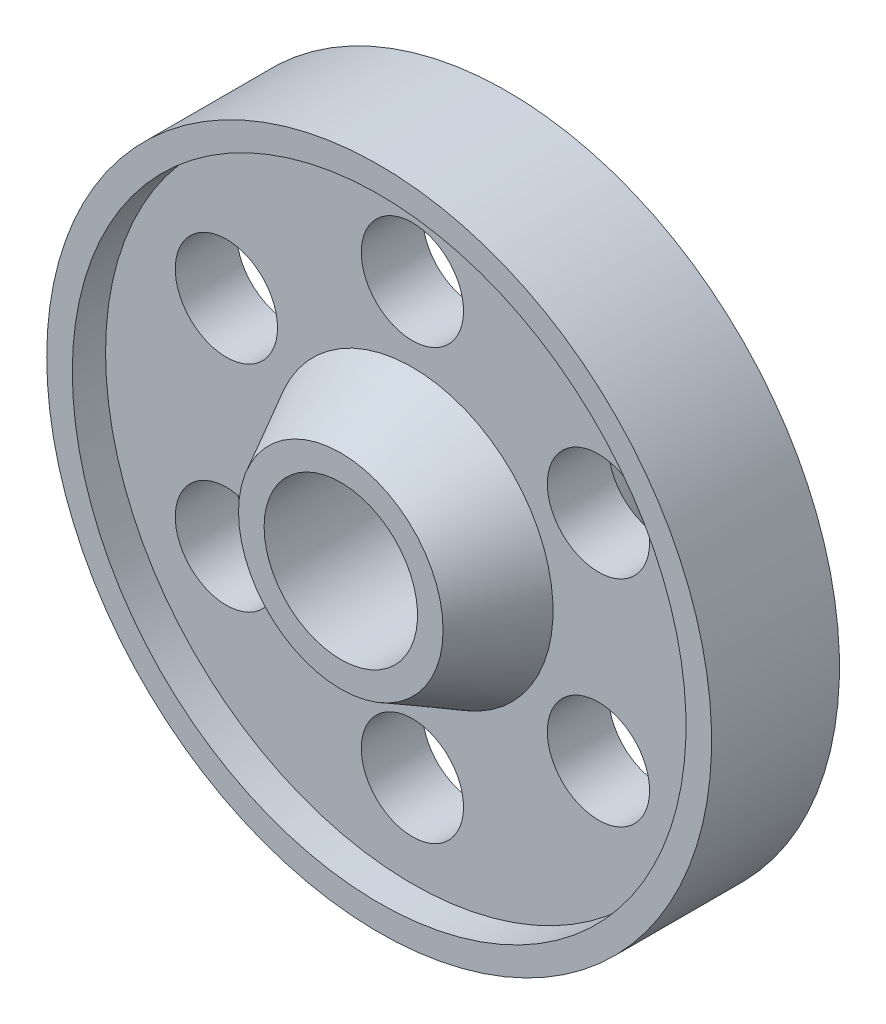
ISO-10303-21;
HEADER;
FILE_DESCRIPTION(('STEP AP214'),'2;1');
FILE_NAME('part.step','',(''),(''),'','','');
FILE_SCHEMA(('AUTOMOTIVE_DESIGN { 1 0 10303 214 1 1 1 1 }'));
ENDSEC;
DATA;
#1=APPLICATION_CONTEXT('core data for automotive mechanical design processes');
#2=APPLICATION_PROTOCOL_DEFINITION('international standard','automotive_design',2000,#1);
#3=PRODUCT_CONTEXT('',#1,'mechanical');
#4=PRODUCT('Part','Part','',(#3));
#5=PRODUCT_RELATED_PRODUCT_CATEGORY('part','',(#4));
#6=PRODUCT_DEFINITION_FORMATION('','',#4);
#7=PRODUCT_DEFINITION_CONTEXT('part definition',#1,'design');
#8=PRODUCT_DEFINITION('design','',#6,#7);
#9=PRODUCT_DEFINITION_SHAPE('','',#8);
#10=(LENGTH_UNIT() NAMED_UNIT(*) SI_UNIT(.MILLI.,.METRE.));
#11=(NAMED_UNIT(*) PLANE_ANGLE_UNIT() SI_UNIT($,.RADIAN.));
#12=(NAMED_UNIT(*) SI_UNIT($,.STERADIAN.) SOLID_ANGLE_UNIT());
#13=UNCERTAINTY_MEASURE_WITH_UNIT(LENGTH_MEASURE(1.E-05),#10,'distance_accuracy_value','');
#14=(GEOMETRIC_REPRESENTATION_CONTEXT(3) GLOBAL_UNCERTAINTY_ASSIGNED_CONTEXT((#13)) GLOBAL_UNIT_ASSIGNED_CONTEXT((#10,
#11,#12)) REPRESENTATION_CONTEXT('',''));
#15=CARTESIAN_POINT('',(0.,0.,0.));
#16=DIRECTION('',(0.,0.,1.));
#17=DIRECTION('',(1.,0.,0.));
#18=AXIS2_PLACEMENT_3D('',#15,#16,#17);
#19=CARTESIAN_POINT('',(0.,65.,-12.5));
#20=DIRECTION('',(0.,0.,-1.));
#21=DIRECTION('',(-1.,0.,0.));
#22=AXIS2_PLACEMENT_3D('',#19,#20,#21);
#23=PLANE('',#22);
#24=CARTESIAN_POINT('',(0.,0.,-12.5));
#25=DIRECTION('',(0.,0.,-1.));
#26=DIRECTION('',(-1.,0.,0.));
#27=AXIS2_PLACEMENT_3D('',#24,#25,#26);
#28=CIRCLE('',#27,65.);
#29=CARTESIAN_POINT('',(-65.,0.,-12.5));
#30=VERTEX_POINT('',#29);
#31=EDGE_CURVE('E101',#30,#30,#28,.T.);
#32=ORIENTED_EDGE('',*,*,#31,.T.);
#33=EDGE_LOOP('',(#32));
#34=FACE_BOUND('',#33,.T.);
#35=CARTESIAN_POINT('',(0.,0.,-12.5));
#36=DIRECTION('',(0.,0.,-1.));
#37=DIRECTION('',(-1.,0.,0.));
#38=AXIS2_PLACEMENT_3D('',#35,#36,#37);
#39=CIRCLE('',#38,60.);
#40=CARTESIAN_POINT('',(-60.,0.,-12.5));
#41=VERTEX_POINT('',#40);
#42=EDGE_CURVE('E10',#41,#41,#39,.T.);
#43=ORIENTED_EDGE('',*,*,#42,.F.);
#44=EDGE_LOOP('',(#43));
#45=FACE_BOUND('',#44,.T.);
#46=ADVANCED_FACE('F43',(#34,#45),#23,.T.);
#47=CARTESIAN_POINT('',(0.,0.,-27.7058387707907));
#48=DIRECTION('',(0.,0.,-1.));
#49=DIRECTION('',(-1.,0.,0.));
#50=AXIS2_PLACEMENT_3D('',#47,#48,#49);
#51=CYLINDRICAL_SURFACE('',#50,60.);
#52=ORIENTED_EDGE('',*,*,#42,.T.);
#53=EDGE_LOOP('',(#52));
#54=FACE_BOUND('',#53,.T.);
#55=CARTESIAN_POINT('',(0.,0.,-6.));
#56=DIRECTION('',(0.,0.,-1.));
#57=DIRECTION('',(-1.,0.,0.));
#58=AXIS2_PLACEMENT_3D('',#55,#56,#57);
#59=CIRCLE('',#58,60.);
#60=CARTESIAN_POINT('',(-60.,0.,-6.));
#61=VERTEX_POINT('',#60);
#62=EDGE_CURVE('E51',#61,#61,#59,.T.);
#63=ORIENTED_EDGE('',*,*,#62,.F.);
#64=EDGE_LOOP('',(#63));
#65=FACE_BOUND('',#64,.T.);
#66=ADVANCED_FACE('F145',(#54,#65),#51,.F.);
#67=CARTESIAN_POINT('',(0.,27.5,-6.));
#68=DIRECTION('',(0.,0.,-1.));
#69=DIRECTION('',(-1.,0.,0.));
#70=AXIS2_PLACEMENT_3D('',#67,#68,#69);
#71=PLANE('',#70);
#72=CARTESIAN_POINT('',(0.,42.,-5.99999999999999));
#73=DIRECTION('',(0.,0.,-1.));
#74=DIRECTION('',(-1.,0.,0.));
#75=AXIS2_PLACEMENT_3D('',#72,#73,#74);
#76=CIRCLE('',#75,10.);
#77=CARTESIAN_POINT('',(-10.,42.,-5.99999999999999));
#78=VERTEX_POINT('',#77);
#79=EDGE_CURVE('E97',#78,#78,#76,.T.);
#80=ORIENTED_EDGE('',*,*,#79,.F.);
#81=EDGE_LOOP('',(#80));
#82=FACE_BOUND('',#81,.T.);
#83=CARTESIAN_POINT('',(-36.3730669589462,21.0000000000004,-5.99999999999999));
#84=DIRECTION('',(0.,0.,-1.));
#85=DIRECTION('',(-1.,0.,0.));
#86=AXIS2_PLACEMENT_3D('',#83,#84,#85);
#87=CIRCLE('',#86,10.);
#88=CARTESIAN_POINT('',(-46.3730669589462,21.0000000000004,-5.99999999999999));
#89=VERTEX_POINT('',#88);
#90=EDGE_CURVE('E83',#89,#89,#87,.T.);
#91=ORIENTED_EDGE('',*,*,#90,.F.);
#92=EDGE_LOOP('',(#91));
#93=FACE_BOUND('',#92,.T.);
#94=CARTESIAN_POINT('',(-36.3730669589466,-20.9999999999997,-5.99999999999999));
#95=DIRECTION('',(0.,0.,-1.));
#96=DIRECTION('',(-1.,0.,0.));
#97=AXIS2_PLACEMENT_3D('',#94,#95,#96);
#98=CIRCLE('',#97,10.);
#99=CARTESIAN_POINT('',(-46.3730669589466,-20.9999999999997,-5.99999999999999));
#100=VERTEX_POINT('',#99);
#101=EDGE_CURVE('E79',#100,#100,#98,.T.);
#102=ORIENTED_EDGE('',*,*,#101,.F.);
#103=EDGE_LOOP('',(#102));
#104=FACE_BOUND('',#103,.T.);
#105=CARTESIAN_POINT('',(-2.93284432462823E-13,-42.,-5.99999999999999));
#106=DIRECTION('',(0.,0.,-1.));
#107=DIRECTION('',(-1.,0.,0.));
#108=AXIS2_PLACEMENT_3D('',#105,#106,#107);
#109=CIRCLE('',#108,10.);
#110=CARTESIAN_POINT('',(-10.0000000000003,-42.,-5.99999999999999));
#111=VERTEX_POINT('',#110);
#112=EDGE_CURVE('E75',#111,#111,#109,.T.);
#113=ORIENTED_EDGE('',*,*,#112,.F.);
#114=EDGE_LOOP('',(#113));
#115=FACE_BOUND('',#114,.T.);
#116=CARTESIAN_POINT('',(36.3730669589463,-21.0000000000002,-5.99999999999999));
#117=DIRECTION('',(0.,0.,-1.));
#118=DIRECTION('',(-1.,0.,0.));
#119=AXIS2_PLACEMENT_3D('',#116,#117,#118);
#120=CIRCLE('',#119,10.);
#121=CARTESIAN_POINT('',(26.3730669589463,-21.0000000000002,-5.99999999999999));
#122=VERTEX_POINT('',#121);
#123=EDGE_CURVE('E70',#122,#122,#120,.T.);
#124=ORIENTED_EDGE('',*,*,#123,.F.);
#125=EDGE_LOOP('',(#124));
#126=FACE_BOUND('',#125,.T.);
#127=CARTESIAN_POINT('',(36.3730669589465,20.9999999999999,-5.99999999999999));
#128=DIRECTION('',(0.,0.,-1.));
#129=DIRECTION('',(-1.,0.,0.));
#130=AXIS2_PLACEMENT_3D('',#127,#128,#129);
#131=CIRCLE('',#130,10.);
#132=CARTESIAN_POINT('',(26.3730669589465,20.9999999999999,-5.99999999999999));
#133=VERTEX_POINT('',#132);
#134=EDGE_CURVE('E65',#133,#133,#131,.T.);
#135=ORIENTED_EDGE('',*,*,#134,.F.);
#136=EDGE_LOOP('',(#135));
#137=FACE_BOUND('',#136,.T.);
#138=ORIENTED_EDGE('',*,*,#62,.T.);
#139=EDGE_LOOP('',(#138));
#140=FACE_BOUND('',#139,.T.);
#141=CARTESIAN_POINT('',(0.,0.,-5.99999999999999));
#142=DIRECTION('',(0.,0.,-1.));
#143=DIRECTION('',(-1.,0.,0.));
#144=AXIS2_PLACEMENT_3D('',#141,#142,#143);
#145=CIRCLE('',#144,27.5);
#146=CARTESIAN_POINT('',(-27.5,0.,-5.99999999999999));
#147=VERTEX_POINT('',#146);
#148=EDGE_CURVE('E57',#147,#147,#145,.T.);
#149=ORIENTED_EDGE('',*,*,#148,.F.);
#150=EDGE_LOOP('',(#149));
#151=FACE_BOUND('',#150,.T.);
#152=ADVANCED_FACE('F143',(#82,#93,#104,#115,#126,#137,#140,#151),#71,.T.);
#153=CARTESIAN_POINT('',(0.,0.,-20.));
#154=DIRECTION('',(0.,0.,1.));
#155=DIRECTION('',(1.,0.,0.));
#156=AXIS2_PLACEMENT_3D('',#153,#154,#155);
#157=CONICAL_SURFACE('',#156,20.,0.491809175988698);
#158=ORIENTED_EDGE('',*,*,#148,.T.);
#159=EDGE_LOOP('',(#158));
#160=FACE_BOUND('',#159,.T.);
#161=CARTESIAN_POINT('',(0.,0.,-20.));
#162=DIRECTION('',(0.,0.,-1.));
#163=DIRECTION('',(-1.,0.,0.));
#164=AXIS2_PLACEMENT_3D('',#161,#162,#163);
#165=CIRCLE('',#164,20.);
#166=CARTESIAN_POINT('',(-20.,0.,-20.));
#167=VERTEX_POINT('',#166);
#168=EDGE_CURVE('E133',#167,#167,#165,.T.);
#169=ORIENTED_EDGE('',*,*,#168,.F.);
#170=EDGE_LOOP('',(#169));
#171=FACE_BOUND('',#170,.T.);
#172=ADVANCED_FACE('F140',(#160,#171),#157,.T.);
#173=CARTESIAN_POINT('',(0.,15.,-20.));
#174=DIRECTION('',(0.,0.,-1.));
#175=DIRECTION('',(-1.,0.,0.));
#176=AXIS2_PLACEMENT_3D('',#173,#174,#175);
#177=PLANE('',#176);
#178=ORIENTED_EDGE('',*,*,#168,.T.);
#179=EDGE_LOOP('',(#178));
#180=FACE_BOUND('',#179,.T.);
#181=CARTESIAN_POINT('',(0.,0.,-20.));
#182=DIRECTION('',(0.,0.,-1.));
#183=DIRECTION('',(-1.,0.,0.));
#184=AXIS2_PLACEMENT_3D('',#181,#182,#183);
#185=CIRCLE('',#184,15.);
#186=CARTESIAN_POINT('',(-15.,0.,-20.));
#187=VERTEX_POINT('',#186);
#188=EDGE_CURVE('E129',#187,#187,#185,.T.);
#189=ORIENTED_EDGE('',*,*,#188,.F.);
#190=EDGE_LOOP('',(#189));
#191=FACE_BOUND('',#190,.T.);
#192=ADVANCED_FACE('F152',(#180,#191),#177,.T.);
#193=CARTESIAN_POINT('',(0.,0.,-27.7058387707907));
#194=DIRECTION('',(0.,0.,-1.));
#195=DIRECTION('',(-1.,0.,0.));
#196=AXIS2_PLACEMENT_3D('',#193,#194,#195);
#197=CYLINDRICAL_SURFACE('',#196,15.);
#198=ORIENTED_EDGE('',*,*,#188,.T.);
#199=EDGE_LOOP('',(#198));
#200=FACE_BOUND('',#199,.T.);
#201=CARTESIAN_POINT('',(0.,0.,20.));
#202=DIRECTION('',(0.,0.,-1.));
#203=DIRECTION('',(-1.,0.,0.));
#204=AXIS2_PLACEMENT_3D('',#201,#202,#203);
#205=CIRCLE('',#204,15.);
#206=CARTESIAN_POINT('',(-15.,0.,20.));
#207=VERTEX_POINT('',#206);
#208=EDGE_CURVE('E125',#207,#207,#205,.T.);
#209=ORIENTED_EDGE('',*,*,#208,.F.);
#210=EDGE_LOOP('',(#209));
#211=FACE_BOUND('',#210,.T.);
#212=ADVANCED_FACE('F197',(#200,#211),#197,.F.);
#213=CARTESIAN_POINT('',(0.,15.,20.));
#214=DIRECTION('',(0.,0.,1.));
#215=DIRECTION('',(1.,0.,0.));
#216=AXIS2_PLACEMENT_3D('',#213,#214,#215);
#217=PLANE('',#216);
#218=ORIENTED_EDGE('',*,*,#208,.T.);
#219=EDGE_LOOP('',(#218));
#220=FACE_BOUND('',#219,.T.);
#221=CARTESIAN_POINT('',(0.,0.,20.));
#222=DIRECTION('',(0.,0.,-1.));
#223=DIRECTION('',(-1.,0.,0.));
#224=AXIS2_PLACEMENT_3D('',#221,#222,#223);
#225=CIRCLE('',#224,20.);
#226=CARTESIAN_POINT('',(-20.,0.,20.));
#227=VERTEX_POINT('',#226);
#228=EDGE_CURVE('E121',#227,#227,#225,.T.);
#229=ORIENTED_EDGE('',*,*,#228,.F.);
#230=EDGE_LOOP('',(#229));
#231=FACE_BOUND('',#230,.T.);
#232=ADVANCED_FACE('F193',(#220,#231),#217,.T.);
#233=CARTESIAN_POINT('',(0.,0.,6.));
#234=DIRECTION('',(0.,0.,-1.));
#235=DIRECTION('',(-1.,0.,0.));
#236=AXIS2_PLACEMENT_3D('',#233,#234,#235);
#237=CONICAL_SURFACE('',#236,27.5,0.491809175988698);
#238=ORIENTED_EDGE('',*,*,#228,.T.);
#239=EDGE_LOOP('',(#238));
#240=FACE_BOUND('',#239,.T.);
#241=CARTESIAN_POINT('',(0.,0.,6.));
#242=DIRECTION('',(0.,0.,-1.));
#243=DIRECTION('',(-1.,0.,0.));
#244=AXIS2_PLACEMENT_3D('',#241,#242,#243);
#245=CIRCLE('',#244,27.5);
#246=CARTESIAN_POINT('',(-27.5,0.,6.));
#247=VERTEX_POINT('',#246);
#248=EDGE_CURVE('E117',#247,#247,#245,.T.);
#249=ORIENTED_EDGE('',*,*,#248,.F.);
#250=EDGE_LOOP('',(#249));
#251=FACE_BOUND('',#250,.T.);
#252=ADVANCED_FACE('F189',(#240,#251),#237,.T.);
#253=CARTESIAN_POINT('',(0.,60.,6.));
#254=DIRECTION('',(0.,0.,1.));
#255=DIRECTION('',(1.,0.,0.));
#256=AXIS2_PLACEMENT_3D('',#253,#254,#255);
#257=PLANE('',#256);
#258=CARTESIAN_POINT('',(0.,42.,6.));
#259=DIRECTION('',(0.,0.,1.));
#260=DIRECTION('',(1.,0.,0.));
#261=AXIS2_PLACEMENT_3D('',#258,#259,#260);
#262=CIRCLE('',#261,10.);
#263=CARTESIAN_POINT('',(10.,42.,6.));
#264=VERTEX_POINT('',#263);
#265=EDGE_CURVE('E46',#264,#264,#262,.T.);
#266=ORIENTED_EDGE('',*,*,#265,.F.);
#267=EDGE_LOOP('',(#266));
#268=FACE_BOUND('',#267,.T.);
#269=CARTESIAN_POINT('',(-36.3730669589462,21.0000000000004,6.));
#270=DIRECTION('',(0.,0.,1.));
#271=DIRECTION('',(1.,0.,0.));
#272=AXIS2_PLACEMENT_3D('',#269,#270,#271);
#273=CIRCLE('',#272,10.);
#274=CARTESIAN_POINT('',(-26.3730669589462,21.0000000000004,6.));
#275=VERTEX_POINT('',#274);
#276=EDGE_CURVE('E80',#275,#275,#273,.T.);
#277=ORIENTED_EDGE('',*,*,#276,.F.);
#278=EDGE_LOOP('',(#277));
#279=FACE_BOUND('',#278,.T.);
#280=CARTESIAN_POINT('',(-36.3730669589466,-20.9999999999997,6.));
#281=DIRECTION('',(0.,0.,1.));
#282=DIRECTION('',(1.,0.,0.));
#283=AXIS2_PLACEMENT_3D('',#280,#281,#282);
#284=CIRCLE('',#283,10.);
#285=CARTESIAN_POINT('',(-26.3730669589466,-20.9999999999997,6.));
#286=VERTEX_POINT('',#285);
#287=EDGE_CURVE('E76',#286,#286,#284,.T.);
#288=ORIENTED_EDGE('',*,*,#287,.F.);
#289=EDGE_LOOP('',(#288));
#290=FACE_BOUND('',#289,.T.);
#291=CARTESIAN_POINT('',(-2.93284432462823E-13,-42.,6.));
#292=DIRECTION('',(0.,0.,1.));
#293=DIRECTION('',(1.,0.,0.));
#294=AXIS2_PLACEMENT_3D('',#291,#292,#293);
#295=CIRCLE('',#294,10.);
#296=CARTESIAN_POINT('',(9.99999999999971,-42.,6.));
#297=VERTEX_POINT('',#296);
#298=EDGE_CURVE('E71',#297,#297,#295,.T.);
#299=ORIENTED_EDGE('',*,*,#298,.F.);
#300=EDGE_LOOP('',(#299));
#301=FACE_BOUND('',#300,.T.);
#302=CARTESIAN_POINT('',(36.3730669589463,-21.0000000000002,6.));
#303=DIRECTION('',(0.,0.,1.));
#304=DIRECTION('',(1.,0.,0.));
#305=AXIS2_PLACEMENT_3D('',#302,#303,#304);
#306=CIRCLE('',#305,10.);
#307=CARTESIAN_POINT('',(46.3730669589463,-21.0000000000002,6.));
#308=VERTEX_POINT('',#307);
#309=EDGE_CURVE('E66',#308,#308,#306,.T.);
#310=ORIENTED_EDGE('',*,*,#309,.F.);
#311=EDGE_LOOP('',(#310));
#312=FACE_BOUND('',#311,.T.);
#313=CARTESIAN_POINT('',(36.3730669589465,20.9999999999999,6.));
#314=DIRECTION('',(0.,0.,1.));
#315=DIRECTION('',(1.,0.,0.));
#316=AXIS2_PLACEMENT_3D('',#313,#314,#315);
#317=CIRCLE('',#316,10.);
#318=CARTESIAN_POINT('',(46.3730669589465,20.9999999999999,6.));
#319=VERTEX_POINT('',#318);
#320=EDGE_CURVE('E61',#319,#319,#317,.T.);
#321=ORIENTED_EDGE('',*,*,#320,.F.);
#322=EDGE_LOOP('',(#321));
#323=FACE_BOUND('',#322,.T.);
#324=ORIENTED_EDGE('',*,*,#248,.T.);
#325=EDGE_LOOP('',(#324));
#326=FACE_BOUND('',#325,.T.);
#327=CARTESIAN_POINT('',(0.,0.,6.));
#328=DIRECTION('',(0.,0.,-1.));
#329=DIRECTION('',(-1.,0.,0.));
#330=AXIS2_PLACEMENT_3D('',#327,#328,#329);
#331=CIRCLE('',#330,60.);
#332=CARTESIAN_POINT('',(-60.,0.,6.));
#333=VERTEX_POINT('',#332);
#334=EDGE_CURVE('E113',#333,#333,#331,.T.);
#335=ORIENTED_EDGE('',*,*,#334,.F.);
#336=EDGE_LOOP('',(#335));
#337=FACE_BOUND('',#336,.T.);
#338=ADVANCED_FACE('F185',(#268,#279,#290,#301,#312,#323,#326,#337),#257,.T.);
#339=CARTESIAN_POINT('',(0.,0.,-27.7058387707907));
#340=DIRECTION('',(0.,0.,-1.));
#341=DIRECTION('',(-1.,0.,0.));
#342=AXIS2_PLACEMENT_3D('',#339,#340,#341);
#343=CYLINDRICAL_SURFACE('',#342,60.);
#344=ORIENTED_EDGE('',*,*,#334,.T.);
#345=EDGE_LOOP('',(#344));
#346=FACE_BOUND('',#345,.T.);
#347=CARTESIAN_POINT('',(0.,0.,12.5));
#348=DIRECTION('',(0.,0.,-1.));
#349=DIRECTION('',(-1.,0.,0.));
#350=AXIS2_PLACEMENT_3D('',#347,#348,#349);
#351=CIRCLE('',#350,60.);
#352=CARTESIAN_POINT('',(-60.,0.,12.5));
#353=VERTEX_POINT('',#352);
#354=EDGE_CURVE('E109',#353,#353,#351,.T.);
#355=ORIENTED_EDGE('',*,*,#354,.F.);
#356=EDGE_LOOP('',(#355));
#357=FACE_BOUND('',#356,.T.);
#358=ADVANCED_FACE('F176',(#346,#357),#343,.F.);
#359=CARTESIAN_POINT('',(0.,65.,12.5));
#360=DIRECTION('',(0.,0.,1.));
#361=DIRECTION('',(1.,0.,0.));
#362=AXIS2_PLACEMENT_3D('',#359,#360,#361);
#363=PLANE('',#362);
#364=ORIENTED_EDGE('',*,*,#354,.T.);
#365=EDGE_LOOP('',(#364));
#366=FACE_BOUND('',#365,.T.);
#367=CARTESIAN_POINT('',(0.,0.,12.5));
#368=DIRECTION('',(0.,0.,-1.));
#369=DIRECTION('',(-1.,0.,0.));
#370=AXIS2_PLACEMENT_3D('',#367,#368,#369);
#371=CIRCLE('',#370,65.);
#372=CARTESIAN_POINT('',(-65.,0.,12.5));
#373=VERTEX_POINT('',#372);
#374=EDGE_CURVE('E105',#373,#373,#371,.T.);
#375=ORIENTED_EDGE('',*,*,#374,.F.);
#376=EDGE_LOOP('',(#375));
#377=FACE_BOUND('',#376,.T.);
#378=ADVANCED_FACE('F166',(#366,#377),#363,.T.);
#379=CARTESIAN_POINT('',(0.,0.,-27.7058387707907));
#380=DIRECTION('',(0.,0.,-1.));
#381=DIRECTION('',(-1.,0.,0.));
#382=AXIS2_PLACEMENT_3D('',#379,#380,#381);
#383=CYLINDRICAL_SURFACE('',#382,65.);
#384=ORIENTED_EDGE('',*,*,#374,.T.);
#385=EDGE_LOOP('',(#384));
#386=FACE_BOUND('',#385,.T.);
#387=ORIENTED_EDGE('',*,*,#31,.F.);
#388=EDGE_LOOP('',(#387));
#389=FACE_BOUND('',#388,.T.);
#390=ADVANCED_FACE('F163',(#386,#389),#383,.T.);
#391=CARTESIAN_POINT('',(36.3730669589465,20.9999999999999,-20.));
#392=DIRECTION('',(0.,0.,1.));
#393=DIRECTION('',(1.,0.,0.));
#394=AXIS2_PLACEMENT_3D('',#391,#392,#393);
#395=CYLINDRICAL_SURFACE('',#394,10.);
#396=ORIENTED_EDGE('',*,*,#134,.T.);
#397=EDGE_LOOP('',(#396));
#398=FACE_BOUND('',#397,.T.);
#399=ORIENTED_EDGE('',*,*,#320,.T.);
#400=EDGE_LOOP('',(#399));
#401=FACE_BOUND('',#400,.T.);
#402=ADVANCED_FACE('F165',(#398,#401),#395,.F.);
#403=CARTESIAN_POINT('',(36.3730669589463,-21.0000000000002,-20.));
#404=DIRECTION('',(0.,0.,1.));
#405=DIRECTION('',(1.,0.,0.));
#406=AXIS2_PLACEMENT_3D('',#403,#404,#405);
#407=CYLINDRICAL_SURFACE('',#406,10.);
#408=ORIENTED_EDGE('',*,*,#123,.T.);
#409=EDGE_LOOP('',(#408));
#410=FACE_BOUND('',#409,.T.);
#411=ORIENTED_EDGE('',*,*,#309,.T.);
#412=EDGE_LOOP('',(#411));
#413=FACE_BOUND('',#412,.T.);
#414=ADVANCED_FACE('F173',(#410,#413),#407,.F.);
#415=CARTESIAN_POINT('',(-2.93284432462823E-13,-42.,-20.));
#416=DIRECTION('',(0.,0.,1.));
#417=DIRECTION('',(1.,0.,0.));
#418=AXIS2_PLACEMENT_3D('',#415,#416,#417);
#419=CYLINDRICAL_SURFACE('',#418,10.);
#420=ORIENTED_EDGE('',*,*,#112,.T.);
#421=EDGE_LOOP('',(#420));
#422=FACE_BOUND('',#421,.T.);
#423=ORIENTED_EDGE('',*,*,#298,.T.);
#424=EDGE_LOOP('',(#423));
#425=FACE_BOUND('',#424,.T.);
#426=ADVANCED_FACE('F314',(#422,#425),#419,.F.);
#427=CARTESIAN_POINT('',(-36.3730669589466,-20.9999999999997,-20.));
#428=DIRECTION('',(0.,0.,1.));
#429=DIRECTION('',(1.,0.,0.));
#430=AXIS2_PLACEMENT_3D('',#427,#428,#429);
#431=CYLINDRICAL_SURFACE('',#430,10.);
#432=ORIENTED_EDGE('',*,*,#101,.T.);
#433=EDGE_LOOP('',(#432));
#434=FACE_BOUND('',#433,.T.);
#435=ORIENTED_EDGE('',*,*,#287,.T.);
#436=EDGE_LOOP('',(#435));
#437=FACE_BOUND('',#436,.T.);
#438=ADVANCED_FACE('F180',(#434,#437),#431,.F.);
#439=CARTESIAN_POINT('',(-36.3730669589462,21.0000000000004,-20.));
#440=DIRECTION('',(0.,0.,1.));
#441=DIRECTION('',(1.,0.,0.));
#442=AXIS2_PLACEMENT_3D('',#439,#440,#441);
#443=CYLINDRICAL_SURFACE('',#442,10.);
#444=ORIENTED_EDGE('',*,*,#90,.T.);
#445=EDGE_LOOP('',(#444));
#446=FACE_BOUND('',#445,.T.);
#447=ORIENTED_EDGE('',*,*,#276,.T.);
#448=EDGE_LOOP('',(#447));
#449=FACE_BOUND('',#448,.T.);
#450=ADVANCED_FACE('F332',(#446,#449),#443,.F.);
#451=CARTESIAN_POINT('',(0.,42.,-20.));
#452=DIRECTION('',(0.,0.,1.));
#453=DIRECTION('',(1.,0.,0.));
#454=AXIS2_PLACEMENT_3D('',#451,#452,#453);
#455=CYLINDRICAL_SURFACE('',#454,10.);
#456=ORIENTED_EDGE('',*,*,#79,.T.);
#457=EDGE_LOOP('',(#456));
#458=FACE_BOUND('',#457,.T.);
#459=ORIENTED_EDGE('',*,*,#265,.T.);
#460=EDGE_LOOP('',(#459));
#461=FACE_BOUND('',#460,.T.);
#462=ADVANCED_FACE('F340',(#458,#461),#455,.F.);
#463=CLOSED_SHELL('',(#46,#66,#152,#172,#192,#212,#232,#252,#338,#358,#378,#390,#402,#414,#426,
#438,#450,#462));
#464=MANIFOLD_SOLID_BREP('B2',#463);
#465=ADVANCED_BREP_SHAPE_REPRESENTATION('',(#18,#464),#14);
#466=SHAPE_DEFINITION_REPRESENTATION(#9,#465);
ENDSEC;
END-ISO-10303-21;
